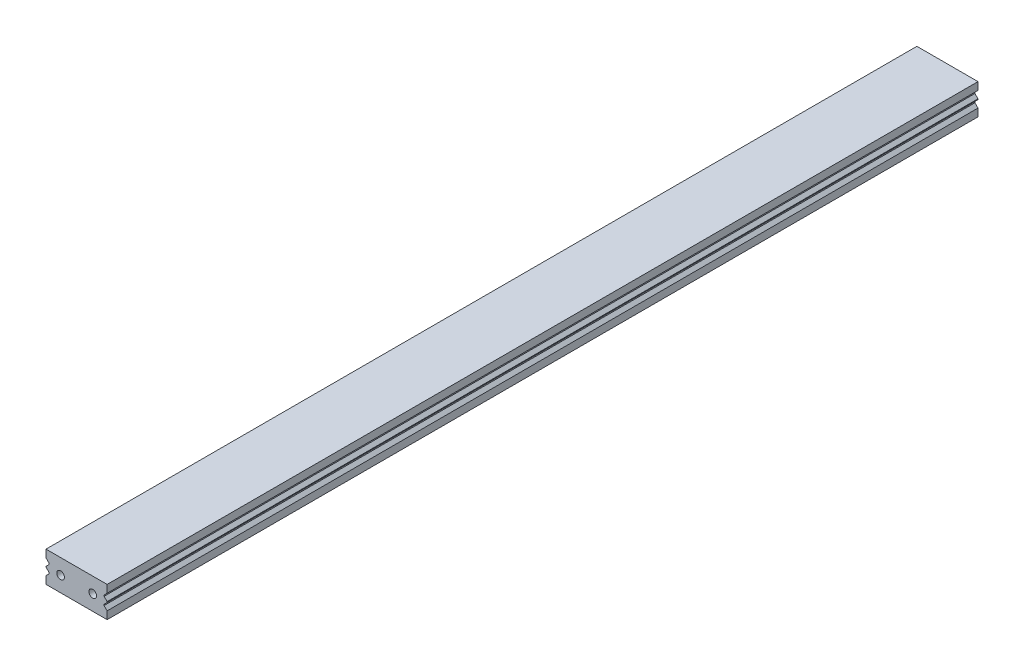
ISO-10303-21;
HEADER;
FILE_DESCRIPTION(('STEP AP214'),'2;1');
FILE_NAME('part.step','',(''),(''),'','','');
FILE_SCHEMA(('AUTOMOTIVE_DESIGN { 1 0 10303 214 1 1 1 1 }'));
ENDSEC;
DATA;
#1=APPLICATION_CONTEXT('core data for automotive mechanical design processes');
#2=APPLICATION_PROTOCOL_DEFINITION('international standard','automotive_design',2000,#1);
#3=PRODUCT_CONTEXT('',#1,'mechanical');
#4=PRODUCT('Part','Part','',(#3));
#5=PRODUCT_RELATED_PRODUCT_CATEGORY('part','',(#4));
#6=PRODUCT_DEFINITION_FORMATION('','',#4);
#7=PRODUCT_DEFINITION_CONTEXT('part definition',#1,'design');
#8=PRODUCT_DEFINITION('design','',#6,#7);
#9=PRODUCT_DEFINITION_SHAPE('','',#8);
#10=(LENGTH_UNIT() NAMED_UNIT(*) SI_UNIT(.MILLI.,.METRE.));
#11=(NAMED_UNIT(*) PLANE_ANGLE_UNIT() SI_UNIT($,.RADIAN.));
#12=(NAMED_UNIT(*) SI_UNIT($,.STERADIAN.) SOLID_ANGLE_UNIT());
#13=UNCERTAINTY_MEASURE_WITH_UNIT(LENGTH_MEASURE(1.E-05),#10,'distance_accuracy_value','');
#14=(GEOMETRIC_REPRESENTATION_CONTEXT(3) GLOBAL_UNCERTAINTY_ASSIGNED_CONTEXT((#13)) GLOBAL_UNIT_ASSIGNED_CONTEXT((#10,
#11,#12)) REPRESENTATION_CONTEXT('',''));
#15=CARTESIAN_POINT('',(0.,0.,0.));
#16=DIRECTION('',(0.,0.,1.));
#17=DIRECTION('',(1.,0.,0.));
#18=AXIS2_PLACEMENT_3D('',#15,#16,#17);
#19=CARTESIAN_POINT('',(10.,10.,-570.));
#20=DIRECTION('',(0.,1.,0.));
#21=DIRECTION('',(0.,0.,1.));
#22=AXIS2_PLACEMENT_3D('',#19,#20,#21);
#23=PLANE('',#22);
#24=DIRECTION('',(-1.,0.,0.));
#25=VECTOR('',#24,1.);
#26=CARTESIAN_POINT('',(10.,10.,0.));
#27=LINE('',#26,#25);
#28=CARTESIAN_POINT('',(50.,10.,0.));
#29=VERTEX_POINT('',#28);
#30=CARTESIAN_POINT('',(10.,10.,0.));
#31=VERTEX_POINT('',#30);
#32=EDGE_CURVE('E156',#29,#31,#27,.T.);
#33=ORIENTED_EDGE('',*,*,#32,.F.);
#34=DIRECTION('',(0.,0.,1.));
#35=VECTOR('',#34,1.);
#36=CARTESIAN_POINT('',(50.,10.,-570.));
#37=LINE('',#36,#35);
#38=CARTESIAN_POINT('',(50.,10.,-570.));
#39=VERTEX_POINT('',#38);
#40=EDGE_CURVE('E160',#39,#29,#37,.T.);
#41=ORIENTED_EDGE('',*,*,#40,.F.);
#42=DIRECTION('',(-1.,0.,0.));
#43=VECTOR('',#42,1.);
#44=CARTESIAN_POINT('',(10.,10.,-570.));
#45=LINE('',#44,#43);
#46=CARTESIAN_POINT('',(10.,10.,-570.));
#47=VERTEX_POINT('',#46);
#48=EDGE_CURVE('E186',#39,#47,#45,.T.);
#49=ORIENTED_EDGE('',*,*,#48,.T.);
#50=DIRECTION('',(0.,0.,1.));
#51=VECTOR('',#50,1.);
#52=CARTESIAN_POINT('',(10.,10.,-570.));
#53=LINE('',#52,#51);
#54=EDGE_CURVE('E43',#47,#31,#53,.T.);
#55=ORIENTED_EDGE('',*,*,#54,.T.);
#56=EDGE_LOOP('',(#33,#41,#49,#55));
#57=FACE_BOUND('',#56,.T.);
#58=ADVANCED_FACE('F40',(#57),#23,.T.);
#59=CARTESIAN_POINT('',(30.,-10.,-570.));
#60=DIRECTION('',(0.,-1.,0.));
#61=DIRECTION('',(0.,0.,-1.));
#62=AXIS2_PLACEMENT_3D('',#59,#60,#61);
#63=PLANE('',#62);
#64=DIRECTION('',(1.,0.,0.));
#65=VECTOR('',#64,1.);
#66=CARTESIAN_POINT('',(30.,-10.,0.));
#67=LINE('',#66,#65);
#68=CARTESIAN_POINT('',(10.,-10.,0.));
#69=VERTEX_POINT('',#68);
#70=CARTESIAN_POINT('',(50.,-10.,0.));
#71=VERTEX_POINT('',#70);
#72=EDGE_CURVE('E184',#69,#71,#67,.T.);
#73=ORIENTED_EDGE('',*,*,#72,.F.);
#74=DIRECTION('',(0.,0.,1.));
#75=VECTOR('',#74,1.);
#76=CARTESIAN_POINT('',(10.,-10.,-570.));
#77=LINE('',#76,#75);
#78=CARTESIAN_POINT('',(10.,-10.,-570.));
#79=VERTEX_POINT('',#78);
#80=EDGE_CURVE('E11',#79,#69,#77,.T.);
#81=ORIENTED_EDGE('',*,*,#80,.F.);
#82=DIRECTION('',(1.,0.,0.));
#83=VECTOR('',#82,1.);
#84=CARTESIAN_POINT('',(30.,-10.,-570.));
#85=LINE('',#84,#83);
#86=CARTESIAN_POINT('',(50.,-10.,-570.));
#87=VERTEX_POINT('',#86);
#88=EDGE_CURVE('E154',#79,#87,#85,.T.);
#89=ORIENTED_EDGE('',*,*,#88,.T.);
#90=DIRECTION('',(0.,0.,1.));
#91=VECTOR('',#90,1.);
#92=CARTESIAN_POINT('',(50.,-10.,-570.));
#93=LINE('',#92,#91);
#94=EDGE_CURVE('E251',#87,#71,#93,.T.);
#95=ORIENTED_EDGE('',*,*,#94,.T.);
#96=EDGE_LOOP('',(#73,#81,#89,#95));
#97=FACE_BOUND('',#96,.T.);
#98=ADVANCED_FACE('F293',(#97),#63,.T.);
#99=CARTESIAN_POINT('',(10.,-10.,-570.));
#100=DIRECTION('',(-1.,0.,0.));
#101=DIRECTION('',(0.,0.,1.));
#102=AXIS2_PLACEMENT_3D('',#99,#100,#101);
#103=PLANE('',#102);
#104=DIRECTION('',(0.,-1.,0.));
#105=VECTOR('',#104,1.);
#106=CARTESIAN_POINT('',(10.,-10.,0.));
#107=LINE('',#106,#105);
#108=CARTESIAN_POINT('',(10.,-5.,0.));
#109=VERTEX_POINT('',#108);
#110=EDGE_CURVE('E181',#109,#69,#107,.T.);
#111=ORIENTED_EDGE('',*,*,#110,.F.);
#112=DIRECTION('',(0.,0.,1.));
#113=VECTOR('',#112,1.);
#114=CARTESIAN_POINT('',(10.,-5.,-570.));
#115=LINE('',#114,#113);
#116=CARTESIAN_POINT('',(10.,-5.,-570.));
#117=VERTEX_POINT('',#116);
#118=EDGE_CURVE('E49',#117,#109,#115,.T.);
#119=ORIENTED_EDGE('',*,*,#118,.F.);
#120=DIRECTION('',(0.,-1.,0.));
#121=VECTOR('',#120,1.);
#122=CARTESIAN_POINT('',(10.,-10.,-570.));
#123=LINE('',#122,#121);
#124=EDGE_CURVE('E144',#117,#79,#123,.T.);
#125=ORIENTED_EDGE('',*,*,#124,.T.);
#126=ORIENTED_EDGE('',*,*,#80,.T.);
#127=EDGE_LOOP('',(#111,#119,#125,#126));
#128=FACE_BOUND('',#127,.T.);
#129=ADVANCED_FACE('F297',(#128),#103,.T.);
#130=CARTESIAN_POINT('',(12.,-3.,-570.));
#131=DIRECTION('',(-0.707106781186548,0.707106781186547,0.));
#132=DIRECTION('',(-0.707106781186547,-0.707106781186548,0.));
#133=AXIS2_PLACEMENT_3D('',#130,#131,#132);
#134=PLANE('',#133);
#135=DIRECTION('',(-0.707106781186547,-0.707106781186548,0.));
#136=VECTOR('',#135,1.);
#137=CARTESIAN_POINT('',(12.,-3.,0.));
#138=LINE('',#137,#136);
#139=CARTESIAN_POINT('',(12.,-3.,0.));
#140=VERTEX_POINT('',#139);
#141=EDGE_CURVE('E129',#140,#109,#138,.T.);
#142=ORIENTED_EDGE('',*,*,#141,.F.);
#143=DIRECTION('',(0.,0.,1.));
#144=VECTOR('',#143,1.);
#145=CARTESIAN_POINT('',(12.,-3.,-570.));
#146=LINE('',#145,#144);
#147=CARTESIAN_POINT('',(12.,-3.,-570.));
#148=VERTEX_POINT('',#147);
#149=EDGE_CURVE('E124',#148,#140,#146,.T.);
#150=ORIENTED_EDGE('',*,*,#149,.F.);
#151=DIRECTION('',(-0.707106781186547,-0.707106781186548,0.));
#152=VECTOR('',#151,1.);
#153=CARTESIAN_POINT('',(12.,-3.,-570.));
#154=LINE('',#153,#152);
#155=EDGE_CURVE('E127',#148,#117,#154,.T.);
#156=ORIENTED_EDGE('',*,*,#155,.T.);
#157=ORIENTED_EDGE('',*,*,#118,.T.);
#158=EDGE_LOOP('',(#142,#150,#156,#157));
#159=FACE_BOUND('',#158,.T.);
#160=ADVANCED_FACE('F126',(#159),#134,.T.);
#161=CARTESIAN_POINT('',(12.,-2.25,-570.));
#162=DIRECTION('',(-1.,0.,0.));
#163=DIRECTION('',(0.,0.,1.));
#164=AXIS2_PLACEMENT_3D('',#161,#162,#163);
#165=PLANE('',#164);
#166=DIRECTION('',(0.,-1.,0.));
#167=VECTOR('',#166,1.);
#168=CARTESIAN_POINT('',(12.,-2.25,0.));
#169=LINE('',#168,#167);
#170=CARTESIAN_POINT('',(12.,-2.25,0.));
#171=VERTEX_POINT('',#170);
#172=EDGE_CURVE('E178',#171,#140,#169,.T.);
#173=ORIENTED_EDGE('',*,*,#172,.F.);
#174=DIRECTION('',(0.,0.,1.));
#175=VECTOR('',#174,1.);
#176=CARTESIAN_POINT('',(12.,-2.25,-570.));
#177=LINE('',#176,#175);
#178=CARTESIAN_POINT('',(12.,-2.25,-570.));
#179=VERTEX_POINT('',#178);
#180=EDGE_CURVE('E134',#179,#171,#177,.T.);
#181=ORIENTED_EDGE('',*,*,#180,.F.);
#182=DIRECTION('',(0.,-1.,0.));
#183=VECTOR('',#182,1.);
#184=CARTESIAN_POINT('',(12.,-2.25,-570.));
#185=LINE('',#184,#183);
#186=EDGE_CURVE('E142',#179,#148,#185,.T.);
#187=ORIENTED_EDGE('',*,*,#186,.T.);
#188=ORIENTED_EDGE('',*,*,#149,.T.);
#189=EDGE_LOOP('',(#173,#181,#187,#188));
#190=FACE_BOUND('',#189,.T.);
#191=ADVANCED_FACE('F146',(#190),#165,.T.);
#192=CARTESIAN_POINT('',(10.,-0.25,-570.));
#193=DIRECTION('',(-0.707106781186547,-0.707106781186547,0.));
#194=DIRECTION('',(0.707106781186548,-0.707106781186548,0.));
#195=AXIS2_PLACEMENT_3D('',#192,#193,#194);
#196=PLANE('',#195);
#197=DIRECTION('',(0.707106781186548,-0.707106781186548,0.));
#198=VECTOR('',#197,1.);
#199=CARTESIAN_POINT('',(10.,-0.25,0.));
#200=LINE('',#199,#198);
#201=CARTESIAN_POINT('',(10.,-0.25,0.));
#202=VERTEX_POINT('',#201);
#203=EDGE_CURVE('E175',#202,#171,#200,.T.);
#204=ORIENTED_EDGE('',*,*,#203,.F.);
#205=DIRECTION('',(0.,0.,1.));
#206=VECTOR('',#205,1.);
#207=CARTESIAN_POINT('',(10.,-0.25,-570.));
#208=LINE('',#207,#206);
#209=CARTESIAN_POINT('',(10.,-0.25,-570.));
#210=VERTEX_POINT('',#209);
#211=EDGE_CURVE('E190',#210,#202,#208,.T.);
#212=ORIENTED_EDGE('',*,*,#211,.F.);
#213=DIRECTION('',(0.707106781186548,-0.707106781186548,0.));
#214=VECTOR('',#213,1.);
#215=CARTESIAN_POINT('',(10.,-0.25,-570.));
#216=LINE('',#215,#214);
#217=EDGE_CURVE('E147',#210,#179,#216,.T.);
#218=ORIENTED_EDGE('',*,*,#217,.T.);
#219=ORIENTED_EDGE('',*,*,#180,.T.);
#220=EDGE_LOOP('',(#204,#212,#218,#219));
#221=FACE_BOUND('',#220,.T.);
#222=ADVANCED_FACE('F283',(#221),#196,.T.);
#223=CARTESIAN_POINT('',(10.,0.25,-570.));
#224=DIRECTION('',(-1.,0.,0.));
#225=DIRECTION('',(0.,-1.,0.));
#226=AXIS2_PLACEMENT_3D('',#223,#224,#225);
#227=PLANE('',#226);
#228=DIRECTION('',(0.,-1.,0.));
#229=VECTOR('',#228,1.);
#230=CARTESIAN_POINT('',(10.,0.25,0.));
#231=LINE('',#230,#229);
#232=CARTESIAN_POINT('',(10.,0.25,0.));
#233=VERTEX_POINT('',#232);
#234=EDGE_CURVE('E172',#233,#202,#231,.T.);
#235=ORIENTED_EDGE('',*,*,#234,.F.);
#236=DIRECTION('',(0.,0.,1.));
#237=VECTOR('',#236,1.);
#238=CARTESIAN_POINT('',(10.,0.25,-570.));
#239=LINE('',#238,#237);
#240=CARTESIAN_POINT('',(10.,0.25,-570.));
#241=VERTEX_POINT('',#240);
#242=EDGE_CURVE('E192',#241,#233,#239,.T.);
#243=ORIENTED_EDGE('',*,*,#242,.F.);
#244=DIRECTION('',(0.,-1.,0.));
#245=VECTOR('',#244,1.);
#246=CARTESIAN_POINT('',(10.,0.25,-570.));
#247=LINE('',#246,#245);
#248=EDGE_CURVE('E149',#241,#210,#247,.T.);
#249=ORIENTED_EDGE('',*,*,#248,.T.);
#250=ORIENTED_EDGE('',*,*,#211,.T.);
#251=EDGE_LOOP('',(#235,#243,#249,#250));
#252=FACE_BOUND('',#251,.T.);
#253=ADVANCED_FACE('F269',(#252),#227,.T.);
#254=CARTESIAN_POINT('',(12.,2.25,-570.));
#255=DIRECTION('',(-0.707106781186548,0.707106781186547,0.));
#256=DIRECTION('',(-0.707106781186547,-0.707106781186548,0.));
#257=AXIS2_PLACEMENT_3D('',#254,#255,#256);
#258=PLANE('',#257);
#259=DIRECTION('',(-0.707106781186547,-0.707106781186548,0.));
#260=VECTOR('',#259,1.);
#261=CARTESIAN_POINT('',(12.,2.25,0.));
#262=LINE('',#261,#260);
#263=CARTESIAN_POINT('',(12.,2.25,0.));
#264=VERTEX_POINT('',#263);
#265=EDGE_CURVE('E169',#264,#233,#262,.T.);
#266=ORIENTED_EDGE('',*,*,#265,.F.);
#267=DIRECTION('',(0.,0.,1.));
#268=VECTOR('',#267,1.);
#269=CARTESIAN_POINT('',(12.,2.25,-570.));
#270=LINE('',#269,#268);
#271=CARTESIAN_POINT('',(12.,2.25,-570.));
#272=VERTEX_POINT('',#271);
#273=EDGE_CURVE('E194',#272,#264,#270,.T.);
#274=ORIENTED_EDGE('',*,*,#273,.F.);
#275=DIRECTION('',(-0.707106781186547,-0.707106781186548,0.));
#276=VECTOR('',#275,1.);
#277=CARTESIAN_POINT('',(12.,2.25,-570.));
#278=LINE('',#277,#276);
#279=EDGE_CURVE('E263',#272,#241,#278,.T.);
#280=ORIENTED_EDGE('',*,*,#279,.T.);
#281=ORIENTED_EDGE('',*,*,#242,.T.);
#282=EDGE_LOOP('',(#266,#274,#280,#281));
#283=FACE_BOUND('',#282,.T.);
#284=ADVANCED_FACE('F275',(#283),#258,.T.);
#285=CARTESIAN_POINT('',(12.,3.,-570.));
#286=DIRECTION('',(-1.,0.,0.));
#287=DIRECTION('',(0.,0.,1.));
#288=AXIS2_PLACEMENT_3D('',#285,#286,#287);
#289=PLANE('',#288);
#290=DIRECTION('',(0.,-1.,0.));
#291=VECTOR('',#290,1.);
#292=CARTESIAN_POINT('',(12.,3.,0.));
#293=LINE('',#292,#291);
#294=CARTESIAN_POINT('',(12.,3.,0.));
#295=VERTEX_POINT('',#294);
#296=EDGE_CURVE('E166',#295,#264,#293,.T.);
#297=ORIENTED_EDGE('',*,*,#296,.F.);
#298=DIRECTION('',(0.,0.,1.));
#299=VECTOR('',#298,1.);
#300=CARTESIAN_POINT('',(12.,3.,-570.));
#301=LINE('',#300,#299);
#302=CARTESIAN_POINT('',(12.,3.,-570.));
#303=VERTEX_POINT('',#302);
#304=EDGE_CURVE('E196',#303,#295,#301,.T.);
#305=ORIENTED_EDGE('',*,*,#304,.F.);
#306=DIRECTION('',(0.,-1.,0.));
#307=VECTOR('',#306,1.);
#308=CARTESIAN_POINT('',(12.,3.,-570.));
#309=LINE('',#308,#307);
#310=EDGE_CURVE('E260',#303,#272,#309,.T.);
#311=ORIENTED_EDGE('',*,*,#310,.T.);
#312=ORIENTED_EDGE('',*,*,#273,.T.);
#313=EDGE_LOOP('',(#297,#305,#311,#312));
#314=FACE_BOUND('',#313,.T.);
#315=ADVANCED_FACE('F278',(#314),#289,.T.);
#316=CARTESIAN_POINT('',(10.,5.,-570.));
#317=DIRECTION('',(-0.707106781186547,-0.707106781186547,0.));
#318=DIRECTION('',(0.707106781186548,-0.707106781186548,0.));
#319=AXIS2_PLACEMENT_3D('',#316,#317,#318);
#320=PLANE('',#319);
#321=DIRECTION('',(0.707106781186548,-0.707106781186548,0.));
#322=VECTOR('',#321,1.);
#323=CARTESIAN_POINT('',(10.,5.,0.));
#324=LINE('',#323,#322);
#325=CARTESIAN_POINT('',(10.,5.,0.));
#326=VERTEX_POINT('',#325);
#327=EDGE_CURVE('E163',#326,#295,#324,.T.);
#328=ORIENTED_EDGE('',*,*,#327,.F.);
#329=DIRECTION('',(0.,0.,1.));
#330=VECTOR('',#329,1.);
#331=CARTESIAN_POINT('',(10.,5.,-570.));
#332=LINE('',#331,#330);
#333=CARTESIAN_POINT('',(10.,5.,-570.));
#334=VERTEX_POINT('',#333);
#335=EDGE_CURVE('E197',#334,#326,#332,.T.);
#336=ORIENTED_EDGE('',*,*,#335,.F.);
#337=DIRECTION('',(0.707106781186548,-0.707106781186548,0.));
#338=VECTOR('',#337,1.);
#339=CARTESIAN_POINT('',(10.,5.,-570.));
#340=LINE('',#339,#338);
#341=EDGE_CURVE('E257',#334,#303,#340,.T.);
#342=ORIENTED_EDGE('',*,*,#341,.T.);
#343=ORIENTED_EDGE('',*,*,#304,.T.);
#344=EDGE_LOOP('',(#328,#336,#342,#343));
#345=FACE_BOUND('',#344,.T.);
#346=ADVANCED_FACE('F281',(#345),#320,.T.);
#347=CARTESIAN_POINT('',(10.,5.,-570.));
#348=DIRECTION('',(-1.,0.,0.));
#349=DIRECTION('',(0.,0.,1.));
#350=AXIS2_PLACEMENT_3D('',#347,#348,#349);
#351=PLANE('',#350);
#352=DIRECTION('',(0.,-1.,0.));
#353=VECTOR('',#352,1.);
#354=CARTESIAN_POINT('',(10.,5.,0.));
#355=LINE('',#354,#353);
#356=EDGE_CURVE('E159',#31,#326,#355,.T.);
#357=ORIENTED_EDGE('',*,*,#356,.F.);
#358=ORIENTED_EDGE('',*,*,#54,.F.);
#359=DIRECTION('',(0.,-1.,0.));
#360=VECTOR('',#359,1.);
#361=CARTESIAN_POINT('',(10.,5.,-570.));
#362=LINE('',#361,#360);
#363=EDGE_CURVE('E255',#47,#334,#362,.T.);
#364=ORIENTED_EDGE('',*,*,#363,.T.);
#365=ORIENTED_EDGE('',*,*,#335,.T.);
#366=EDGE_LOOP('',(#357,#358,#364,#365));
#367=FACE_BOUND('',#366,.T.);
#368=ADVANCED_FACE('F204',(#367),#351,.T.);
#369=CARTESIAN_POINT('',(0.,0.,-570.));
#370=DIRECTION('',(0.,0.,-1.));
#371=DIRECTION('',(-1.,0.,0.));
#372=AXIS2_PLACEMENT_3D('',#369,#370,#371);
#373=PLANE('',#372);
#374=CARTESIAN_POINT('',(40.,0.,-570.));
#375=DIRECTION('',(0.,0.,-1.));
#376=DIRECTION('',(-1.,0.,0.));
#377=AXIS2_PLACEMENT_3D('',#374,#375,#376);
#378=CIRCLE('',#377,2.49999999999999);
#379=CARTESIAN_POINT('',(37.5,0.,-570.));
#380=VERTEX_POINT('',#379);
#381=EDGE_CURVE('E620',#380,#380,#378,.T.);
#382=ORIENTED_EDGE('',*,*,#381,.F.);
#383=EDGE_LOOP('',(#382));
#384=FACE_BOUND('',#383,.T.);
#385=CARTESIAN_POINT('',(20.,0.,-570.));
#386=DIRECTION('',(0.,0.,-1.));
#387=DIRECTION('',(-1.,0.,0.));
#388=AXIS2_PLACEMENT_3D('',#385,#386,#387);
#389=CIRCLE('',#388,2.49999999999999);
#390=CARTESIAN_POINT('',(17.5,0.,-570.));
#391=VERTEX_POINT('',#390);
#392=EDGE_CURVE('E626',#391,#391,#389,.T.);
#393=ORIENTED_EDGE('',*,*,#392,.F.);
#394=EDGE_LOOP('',(#393));
#395=FACE_BOUND('',#394,.T.);
#396=ORIENTED_EDGE('',*,*,#48,.F.);
#397=DIRECTION('',(0.,-1.,0.));
#398=VECTOR('',#397,1.);
#399=CARTESIAN_POINT('',(50.,5.,-570.));
#400=LINE('',#399,#398);
#401=CARTESIAN_POINT('',(50.,5.,-570.));
#402=VERTEX_POINT('',#401);
#403=EDGE_CURVE('E224',#39,#402,#400,.T.);
#404=ORIENTED_EDGE('',*,*,#403,.T.);
#405=DIRECTION('',(-0.707106781186548,-0.707106781186548,0.));
#406=VECTOR('',#405,1.);
#407=CARTESIAN_POINT('',(50.,5.,-570.));
#408=LINE('',#407,#406);
#409=CARTESIAN_POINT('',(48.,3.,-570.));
#410=VERTEX_POINT('',#409);
#411=EDGE_CURVE('E653',#402,#410,#408,.T.);
#412=ORIENTED_EDGE('',*,*,#411,.T.);
#413=DIRECTION('',(0.,-1.,0.));
#414=VECTOR('',#413,1.);
#415=CARTESIAN_POINT('',(48.,3.,-570.));
#416=LINE('',#415,#414);
#417=CARTESIAN_POINT('',(48.,2.25,-570.));
#418=VERTEX_POINT('',#417);
#419=EDGE_CURVE('E650',#410,#418,#416,.T.);
#420=ORIENTED_EDGE('',*,*,#419,.T.);
#421=DIRECTION('',(0.707106781186547,-0.707106781186548,0.));
#422=VECTOR('',#421,1.);
#423=CARTESIAN_POINT('',(48.,2.25,-570.));
#424=LINE('',#423,#422);
#425=CARTESIAN_POINT('',(50.,0.25,-570.));
#426=VERTEX_POINT('',#425);
#427=EDGE_CURVE('E647',#418,#426,#424,.T.);
#428=ORIENTED_EDGE('',*,*,#427,.T.);
#429=DIRECTION('',(0.,-1.,0.));
#430=VECTOR('',#429,1.);
#431=CARTESIAN_POINT('',(50.,0.25,-570.));
#432=LINE('',#431,#430);
#433=CARTESIAN_POINT('',(50.,-0.25,-570.));
#434=VERTEX_POINT('',#433);
#435=EDGE_CURVE('E644',#426,#434,#432,.T.);
#436=ORIENTED_EDGE('',*,*,#435,.T.);
#437=DIRECTION('',(-0.707106781186548,-0.707106781186548,0.));
#438=VECTOR('',#437,1.);
#439=CARTESIAN_POINT('',(50.,-0.25,-570.));
#440=LINE('',#439,#438);
#441=CARTESIAN_POINT('',(48.,-2.25,-570.));
#442=VERTEX_POINT('',#441);
#443=EDGE_CURVE('E641',#434,#442,#440,.T.);
#444=ORIENTED_EDGE('',*,*,#443,.T.);
#445=DIRECTION('',(0.,-1.,0.));
#446=VECTOR('',#445,1.);
#447=CARTESIAN_POINT('',(48.,-2.25,-570.));
#448=LINE('',#447,#446);
#449=CARTESIAN_POINT('',(48.,-3.,-570.));
#450=VERTEX_POINT('',#449);
#451=EDGE_CURVE('E638',#442,#450,#448,.T.);
#452=ORIENTED_EDGE('',*,*,#451,.T.);
#453=DIRECTION('',(0.707106781186547,-0.707106781186548,0.));
#454=VECTOR('',#453,1.);
#455=CARTESIAN_POINT('',(48.,-3.,-570.));
#456=LINE('',#455,#454);
#457=CARTESIAN_POINT('',(50.,-5.,-570.));
#458=VERTEX_POINT('',#457);
#459=EDGE_CURVE('E635',#450,#458,#456,.T.);
#460=ORIENTED_EDGE('',*,*,#459,.T.);
#461=DIRECTION('',(0.,-1.,0.));
#462=VECTOR('',#461,1.);
#463=CARTESIAN_POINT('',(50.,-10.,-570.));
#464=LINE('',#463,#462);
#465=EDGE_CURVE('E219',#458,#87,#464,.T.);
#466=ORIENTED_EDGE('',*,*,#465,.T.);
#467=ORIENTED_EDGE('',*,*,#88,.F.);
#468=ORIENTED_EDGE('',*,*,#124,.F.);
#469=ORIENTED_EDGE('',*,*,#155,.F.);
#470=ORIENTED_EDGE('',*,*,#186,.F.);
#471=ORIENTED_EDGE('',*,*,#217,.F.);
#472=ORIENTED_EDGE('',*,*,#248,.F.);
#473=ORIENTED_EDGE('',*,*,#279,.F.);
#474=ORIENTED_EDGE('',*,*,#310,.F.);
#475=ORIENTED_EDGE('',*,*,#341,.F.);
#476=ORIENTED_EDGE('',*,*,#363,.F.);
#477=EDGE_LOOP('',(#396,#404,#412,#420,#428,#436,#444,#452,#460,#466,#467,#468,#469,#470,#471,
#472,#473,#474,#475,#476));
#478=FACE_BOUND('',#477,.T.);
#479=ADVANCED_FACE('F140',(#384,#395,#478),#373,.T.);
#480=CARTESIAN_POINT('',(0.,0.,0.));
#481=DIRECTION('',(0.,0.,-1.));
#482=DIRECTION('',(-1.,0.,0.));
#483=AXIS2_PLACEMENT_3D('',#480,#481,#482);
#484=PLANE('',#483);
#485=CARTESIAN_POINT('',(19.5727462659231,0.,0.));
#486=DIRECTION('',(0.,0.,1.));
#487=DIRECTION('',(1.,0.,0.));
#488=AXIS2_PLACEMENT_3D('',#485,#486,#487);
#489=CIRCLE('',#488,2.5);
#490=CARTESIAN_POINT('',(22.0727462659231,0.,0.));
#491=VERTEX_POINT('',#490);
#492=EDGE_CURVE('E610',#491,#491,#489,.T.);
#493=ORIENTED_EDGE('',*,*,#492,.F.);
#494=EDGE_LOOP('',(#493));
#495=FACE_BOUND('',#494,.T.);
#496=CARTESIAN_POINT('',(40.5727462659231,0.,0.));
#497=DIRECTION('',(0.,0.,1.));
#498=DIRECTION('',(1.,0.,0.));
#499=AXIS2_PLACEMENT_3D('',#496,#497,#498);
#500=CIRCLE('',#499,2.5);
#501=CARTESIAN_POINT('',(43.0727462659231,0.,0.));
#502=VERTEX_POINT('',#501);
#503=EDGE_CURVE('E612',#502,#502,#500,.T.);
#504=ORIENTED_EDGE('',*,*,#503,.F.);
#505=EDGE_LOOP('',(#504));
#506=FACE_BOUND('',#505,.T.);
#507=ORIENTED_EDGE('',*,*,#32,.T.);
#508=ORIENTED_EDGE('',*,*,#356,.T.);
#509=ORIENTED_EDGE('',*,*,#327,.T.);
#510=ORIENTED_EDGE('',*,*,#296,.T.);
#511=ORIENTED_EDGE('',*,*,#265,.T.);
#512=ORIENTED_EDGE('',*,*,#234,.T.);
#513=ORIENTED_EDGE('',*,*,#203,.T.);
#514=ORIENTED_EDGE('',*,*,#172,.T.);
#515=ORIENTED_EDGE('',*,*,#141,.T.);
#516=ORIENTED_EDGE('',*,*,#110,.T.);
#517=ORIENTED_EDGE('',*,*,#72,.T.);
#518=DIRECTION('',(0.,-1.,0.));
#519=VECTOR('',#518,1.);
#520=CARTESIAN_POINT('',(50.,-10.,0.));
#521=LINE('',#520,#519);
#522=CARTESIAN_POINT('',(50.,-5.,0.));
#523=VERTEX_POINT('',#522);
#524=EDGE_CURVE('E632',#523,#71,#521,.T.);
#525=ORIENTED_EDGE('',*,*,#524,.F.);
#526=DIRECTION('',(0.707106781186547,-0.707106781186548,0.));
#527=VECTOR('',#526,1.);
#528=CARTESIAN_POINT('',(48.,-3.,0.));
#529=LINE('',#528,#527);
#530=CARTESIAN_POINT('',(48.,-3.,0.));
#531=VERTEX_POINT('',#530);
#532=EDGE_CURVE('E659',#531,#523,#529,.T.);
#533=ORIENTED_EDGE('',*,*,#532,.F.);
#534=DIRECTION('',(0.,-1.,0.));
#535=VECTOR('',#534,1.);
#536=CARTESIAN_POINT('',(48.,-2.25,0.));
#537=LINE('',#536,#535);
#538=CARTESIAN_POINT('',(48.,-2.25,0.));
#539=VERTEX_POINT('',#538);
#540=EDGE_CURVE('E662',#539,#531,#537,.T.);
#541=ORIENTED_EDGE('',*,*,#540,.F.);
#542=DIRECTION('',(-0.707106781186548,-0.707106781186548,0.));
#543=VECTOR('',#542,1.);
#544=CARTESIAN_POINT('',(50.,-0.25,0.));
#545=LINE('',#544,#543);
#546=CARTESIAN_POINT('',(50.,-0.25,0.));
#547=VERTEX_POINT('',#546);
#548=EDGE_CURVE('E665',#547,#539,#545,.T.);
#549=ORIENTED_EDGE('',*,*,#548,.F.);
#550=DIRECTION('',(0.,-1.,0.));
#551=VECTOR('',#550,1.);
#552=CARTESIAN_POINT('',(50.,0.25,0.));
#553=LINE('',#552,#551);
#554=CARTESIAN_POINT('',(50.,0.25,0.));
#555=VERTEX_POINT('',#554);
#556=EDGE_CURVE('E668',#555,#547,#553,.T.);
#557=ORIENTED_EDGE('',*,*,#556,.F.);
#558=DIRECTION('',(0.707106781186547,-0.707106781186548,0.));
#559=VECTOR('',#558,1.);
#560=CARTESIAN_POINT('',(48.,2.25,0.));
#561=LINE('',#560,#559);
#562=CARTESIAN_POINT('',(48.,2.25,0.));
#563=VERTEX_POINT('',#562);
#564=EDGE_CURVE('E671',#563,#555,#561,.T.);
#565=ORIENTED_EDGE('',*,*,#564,.F.);
#566=DIRECTION('',(0.,-1.,0.));
#567=VECTOR('',#566,1.);
#568=CARTESIAN_POINT('',(48.,3.,0.));
#569=LINE('',#568,#567);
#570=CARTESIAN_POINT('',(48.,3.,0.));
#571=VERTEX_POINT('',#570);
#572=EDGE_CURVE('E674',#571,#563,#569,.T.);
#573=ORIENTED_EDGE('',*,*,#572,.F.);
#574=DIRECTION('',(-0.707106781186548,-0.707106781186548,0.));
#575=VECTOR('',#574,1.);
#576=CARTESIAN_POINT('',(50.,5.,0.));
#577=LINE('',#576,#575);
#578=CARTESIAN_POINT('',(50.,5.,0.));
#579=VERTEX_POINT('',#578);
#580=EDGE_CURVE('E214',#579,#571,#577,.T.);
#581=ORIENTED_EDGE('',*,*,#580,.F.);
#582=DIRECTION('',(0.,-1.,0.));
#583=VECTOR('',#582,1.);
#584=CARTESIAN_POINT('',(50.,5.,0.));
#585=LINE('',#584,#583);
#586=EDGE_CURVE('E209',#29,#579,#585,.T.);
#587=ORIENTED_EDGE('',*,*,#586,.F.);
#588=EDGE_LOOP('',(#507,#508,#509,#510,#511,#512,#513,#514,#515,#516,#517,#525,#533,#541,#549,
#557,#565,#573,#581,#587));
#589=FACE_BOUND('',#588,.T.);
#590=ADVANCED_FACE('F206',(#495,#506,#589),#484,.F.);
#591=CARTESIAN_POINT('',(50.,5.,-570.));
#592=DIRECTION('',(-1.,0.,0.));
#593=DIRECTION('',(0.,0.,1.));
#594=AXIS2_PLACEMENT_3D('',#591,#592,#593);
#595=PLANE('',#594);
#596=ORIENTED_EDGE('',*,*,#586,.T.);
#597=DIRECTION('',(0.,0.,1.));
#598=VECTOR('',#597,1.);
#599=CARTESIAN_POINT('',(50.,5.,-570.));
#600=LINE('',#599,#598);
#601=EDGE_CURVE('E225',#402,#579,#600,.T.);
#602=ORIENTED_EDGE('',*,*,#601,.F.);
#603=ORIENTED_EDGE('',*,*,#403,.F.);
#604=ORIENTED_EDGE('',*,*,#40,.T.);
#605=EDGE_LOOP('',(#596,#602,#603,#604));
#606=FACE_BOUND('',#605,.T.);
#607=ADVANCED_FACE('F222',(#606),#595,.F.);
#608=CARTESIAN_POINT('',(50.,5.,-570.));
#609=DIRECTION('',(-0.707106781186547,0.707106781186547,0.));
#610=DIRECTION('',(-0.707106781186548,-0.707106781186548,0.));
#611=AXIS2_PLACEMENT_3D('',#608,#609,#610);
#612=PLANE('',#611);
#613=ORIENTED_EDGE('',*,*,#580,.T.);
#614=DIRECTION('',(0.,0.,1.));
#615=VECTOR('',#614,1.);
#616=CARTESIAN_POINT('',(48.,3.,-570.));
#617=LINE('',#616,#615);
#618=EDGE_CURVE('E227',#410,#571,#617,.T.);
#619=ORIENTED_EDGE('',*,*,#618,.F.);
#620=ORIENTED_EDGE('',*,*,#411,.F.);
#621=ORIENTED_EDGE('',*,*,#601,.T.);
#622=EDGE_LOOP('',(#613,#619,#620,#621));
#623=FACE_BOUND('',#622,.T.);
#624=ADVANCED_FACE('F379',(#623),#612,.F.);
#625=CARTESIAN_POINT('',(48.,3.,-570.));
#626=DIRECTION('',(-1.,0.,0.));
#627=DIRECTION('',(0.,0.,1.));
#628=AXIS2_PLACEMENT_3D('',#625,#626,#627);
#629=PLANE('',#628);
#630=ORIENTED_EDGE('',*,*,#572,.T.);
#631=DIRECTION('',(0.,0.,1.));
#632=VECTOR('',#631,1.);
#633=CARTESIAN_POINT('',(48.,2.25,-570.));
#634=LINE('',#633,#632);
#635=EDGE_CURVE('E233',#418,#563,#634,.T.);
#636=ORIENTED_EDGE('',*,*,#635,.F.);
#637=ORIENTED_EDGE('',*,*,#419,.F.);
#638=ORIENTED_EDGE('',*,*,#618,.T.);
#639=EDGE_LOOP('',(#630,#636,#637,#638));
#640=FACE_BOUND('',#639,.T.);
#641=ADVANCED_FACE('F390',(#640),#629,.F.);
#642=CARTESIAN_POINT('',(48.,2.25,-570.));
#643=DIRECTION('',(-0.707106781186548,-0.707106781186547,0.));
#644=DIRECTION('',(0.707106781186547,-0.707106781186548,0.));
#645=AXIS2_PLACEMENT_3D('',#642,#643,#644);
#646=PLANE('',#645);
#647=ORIENTED_EDGE('',*,*,#564,.T.);
#648=DIRECTION('',(0.,0.,1.));
#649=VECTOR('',#648,1.);
#650=CARTESIAN_POINT('',(50.,0.25,-570.));
#651=LINE('',#650,#649);
#652=EDGE_CURVE('E236',#426,#555,#651,.T.);
#653=ORIENTED_EDGE('',*,*,#652,.F.);
#654=ORIENTED_EDGE('',*,*,#427,.F.);
#655=ORIENTED_EDGE('',*,*,#635,.T.);
#656=EDGE_LOOP('',(#647,#653,#654,#655));
#657=FACE_BOUND('',#656,.T.);
#658=ADVANCED_FACE('F400',(#657),#646,.F.);
#659=CARTESIAN_POINT('',(50.,0.25,-570.));
#660=DIRECTION('',(-1.,0.,0.));
#661=DIRECTION('',(0.,-1.,0.));
#662=AXIS2_PLACEMENT_3D('',#659,#660,#661);
#663=PLANE('',#662);
#664=ORIENTED_EDGE('',*,*,#556,.T.);
#665=DIRECTION('',(0.,0.,1.));
#666=VECTOR('',#665,1.);
#667=CARTESIAN_POINT('',(50.,-0.25,-570.));
#668=LINE('',#667,#666);
#669=EDGE_CURVE('E239',#434,#547,#668,.T.);
#670=ORIENTED_EDGE('',*,*,#669,.F.);
#671=ORIENTED_EDGE('',*,*,#435,.F.);
#672=ORIENTED_EDGE('',*,*,#652,.T.);
#673=EDGE_LOOP('',(#664,#670,#671,#672));
#674=FACE_BOUND('',#673,.T.);
#675=ADVANCED_FACE('F410',(#674),#663,.F.);
#676=CARTESIAN_POINT('',(50.,-0.25,-570.));
#677=DIRECTION('',(-0.707106781186547,0.707106781186547,0.));
#678=DIRECTION('',(-0.707106781186548,-0.707106781186548,0.));
#679=AXIS2_PLACEMENT_3D('',#676,#677,#678);
#680=PLANE('',#679);
#681=ORIENTED_EDGE('',*,*,#548,.T.);
#682=DIRECTION('',(0.,0.,1.));
#683=VECTOR('',#682,1.);
#684=CARTESIAN_POINT('',(48.,-2.25,-570.));
#685=LINE('',#684,#683);
#686=EDGE_CURVE('E242',#442,#539,#685,.T.);
#687=ORIENTED_EDGE('',*,*,#686,.F.);
#688=ORIENTED_EDGE('',*,*,#443,.F.);
#689=ORIENTED_EDGE('',*,*,#669,.T.);
#690=EDGE_LOOP('',(#681,#687,#688,#689));
#691=FACE_BOUND('',#690,.T.);
#692=ADVANCED_FACE('F420',(#691),#680,.F.);
#693=CARTESIAN_POINT('',(48.,-2.25,-570.));
#694=DIRECTION('',(-1.,0.,0.));
#695=DIRECTION('',(0.,0.,1.));
#696=AXIS2_PLACEMENT_3D('',#693,#694,#695);
#697=PLANE('',#696);
#698=ORIENTED_EDGE('',*,*,#540,.T.);
#699=DIRECTION('',(0.,0.,1.));
#700=VECTOR('',#699,1.);
#701=CARTESIAN_POINT('',(48.,-3.,-570.));
#702=LINE('',#701,#700);
#703=EDGE_CURVE('E245',#450,#531,#702,.T.);
#704=ORIENTED_EDGE('',*,*,#703,.F.);
#705=ORIENTED_EDGE('',*,*,#451,.F.);
#706=ORIENTED_EDGE('',*,*,#686,.T.);
#707=EDGE_LOOP('',(#698,#704,#705,#706));
#708=FACE_BOUND('',#707,.T.);
#709=ADVANCED_FACE('F430',(#708),#697,.F.);
#710=CARTESIAN_POINT('',(48.,-3.,-570.));
#711=DIRECTION('',(-0.707106781186548,-0.707106781186547,0.));
#712=DIRECTION('',(0.707106781186547,-0.707106781186548,0.));
#713=AXIS2_PLACEMENT_3D('',#710,#711,#712);
#714=PLANE('',#713);
#715=ORIENTED_EDGE('',*,*,#532,.T.);
#716=DIRECTION('',(0.,0.,1.));
#717=VECTOR('',#716,1.);
#718=CARTESIAN_POINT('',(50.,-5.,-570.));
#719=LINE('',#718,#717);
#720=EDGE_CURVE('E248',#458,#523,#719,.T.);
#721=ORIENTED_EDGE('',*,*,#720,.F.);
#722=ORIENTED_EDGE('',*,*,#459,.F.);
#723=ORIENTED_EDGE('',*,*,#703,.T.);
#724=EDGE_LOOP('',(#715,#721,#722,#723));
#725=FACE_BOUND('',#724,.T.);
#726=ADVANCED_FACE('F440',(#725),#714,.F.);
#727=CARTESIAN_POINT('',(50.,-10.,-570.));
#728=DIRECTION('',(-1.,0.,0.));
#729=DIRECTION('',(0.,0.,1.));
#730=AXIS2_PLACEMENT_3D('',#727,#728,#729);
#731=PLANE('',#730);
#732=ORIENTED_EDGE('',*,*,#524,.T.);
#733=ORIENTED_EDGE('',*,*,#94,.F.);
#734=ORIENTED_EDGE('',*,*,#465,.F.);
#735=ORIENTED_EDGE('',*,*,#720,.T.);
#736=EDGE_LOOP('',(#732,#733,#734,#735));
#737=FACE_BOUND('',#736,.T.);
#738=ADVANCED_FACE('F450',(#737),#731,.F.);
#739=CARTESIAN_POINT('',(20.,0.,-553.));
#740=DIRECTION('',(0.,0.,-1.));
#741=DIRECTION('',(-1.,0.,0.));
#742=AXIS2_PLACEMENT_3D('',#739,#740,#741);
#743=CONICAL_SURFACE('',#742,2.5,1.02974425867664);
#744=CARTESIAN_POINT('',(20.,0.,-551.497848452431));
#745=VERTEX_POINT('',#744);
#746=VERTEX_LOOP('',#745);
#747=FACE_BOUND('',#746,.T.);
#748=CARTESIAN_POINT('',(20.,0.,-553.));
#749=DIRECTION('',(0.,0.,-1.));
#750=DIRECTION('',(-1.,0.,0.));
#751=AXIS2_PLACEMENT_3D('',#748,#749,#750);
#752=CIRCLE('',#751,2.5);
#753=CARTESIAN_POINT('',(17.5,0.,-553.));
#754=VERTEX_POINT('',#753);
#755=EDGE_CURVE('E629',#754,#754,#752,.T.);
#756=ORIENTED_EDGE('',*,*,#755,.T.);
#757=EDGE_LOOP('',(#756));
#758=FACE_BOUND('',#757,.T.);
#759=ADVANCED_FACE('F460',(#747,#758),#743,.F.);
#760=CARTESIAN_POINT('',(20.,0.,-570.));
#761=DIRECTION('',(0.,0.,-1.));
#762=DIRECTION('',(-1.,0.,0.));
#763=AXIS2_PLACEMENT_3D('',#760,#761,#762);
#764=CYLINDRICAL_SURFACE('',#763,2.5);
#765=ORIENTED_EDGE('',*,*,#755,.F.);
#766=EDGE_LOOP('',(#765));
#767=FACE_BOUND('',#766,.T.);
#768=ORIENTED_EDGE('',*,*,#392,.T.);
#769=EDGE_LOOP('',(#768));
#770=FACE_BOUND('',#769,.T.);
#771=ADVANCED_FACE('F479',(#767,#770),#764,.F.);
#772=CARTESIAN_POINT('',(40.,0.,-553.));
#773=DIRECTION('',(0.,0.,-1.));
#774=DIRECTION('',(-1.,0.,0.));
#775=AXIS2_PLACEMENT_3D('',#772,#773,#774);
#776=CONICAL_SURFACE('',#775,2.5,1.02974425867664);
#777=CARTESIAN_POINT('',(40.,0.,-551.497848452431));
#778=VERTEX_POINT('',#777);
#779=VERTEX_LOOP('',#778);
#780=FACE_BOUND('',#779,.T.);
#781=CARTESIAN_POINT('',(40.,0.,-553.));
#782=DIRECTION('',(0.,0.,-1.));
#783=DIRECTION('',(-1.,0.,0.));
#784=AXIS2_PLACEMENT_3D('',#781,#782,#783);
#785=CIRCLE('',#784,2.5);
#786=CARTESIAN_POINT('',(37.5,0.,-553.));
#787=VERTEX_POINT('',#786);
#788=EDGE_CURVE('E623',#787,#787,#785,.T.);
#789=ORIENTED_EDGE('',*,*,#788,.T.);
#790=EDGE_LOOP('',(#789));
#791=FACE_BOUND('',#790,.T.);
#792=ADVANCED_FACE('F490',(#780,#791),#776,.F.);
#793=CARTESIAN_POINT('',(40.,0.,-570.));
#794=DIRECTION('',(0.,0.,-1.));
#795=DIRECTION('',(-1.,0.,0.));
#796=AXIS2_PLACEMENT_3D('',#793,#794,#795);
#797=CYLINDRICAL_SURFACE('',#796,2.49999999999999);
#798=ORIENTED_EDGE('',*,*,#788,.F.);
#799=EDGE_LOOP('',(#798));
#800=FACE_BOUND('',#799,.T.);
#801=ORIENTED_EDGE('',*,*,#381,.T.);
#802=EDGE_LOOP('',(#801));
#803=FACE_BOUND('',#802,.T.);
#804=ADVANCED_FACE('F502',(#800,#803),#797,.F.);
#805=CARTESIAN_POINT('',(40.5727462659231,0.,-17.));
#806=DIRECTION('',(0.,0.,1.));
#807=DIRECTION('',(1.,0.,0.));
#808=AXIS2_PLACEMENT_3D('',#805,#806,#807);
#809=CONICAL_SURFACE('',#808,2.5,1.02974425867665);
#810=CARTESIAN_POINT('',(40.5727462659231,0.,-18.5021515475689));
#811=VERTEX_POINT('',#810);
#812=VERTEX_LOOP('',#811);
#813=FACE_BOUND('',#812,.T.);
#814=CARTESIAN_POINT('',(40.5727462659231,0.,-17.));
#815=DIRECTION('',(0.,0.,1.));
#816=DIRECTION('',(1.,0.,0.));
#817=AXIS2_PLACEMENT_3D('',#814,#815,#816);
#818=CIRCLE('',#817,2.5);
#819=CARTESIAN_POINT('',(43.0727462659231,0.,-17.));
#820=VERTEX_POINT('',#819);
#821=EDGE_CURVE('E617',#820,#820,#818,.T.);
#822=ORIENTED_EDGE('',*,*,#821,.T.);
#823=EDGE_LOOP('',(#822));
#824=FACE_BOUND('',#823,.T.);
#825=ADVANCED_FACE('F512',(#813,#824),#809,.F.);
#826=CARTESIAN_POINT('',(40.5727462659231,0.,0.));
#827=DIRECTION('',(0.,0.,1.));
#828=DIRECTION('',(1.,0.,0.));
#829=AXIS2_PLACEMENT_3D('',#826,#827,#828);
#830=CYLINDRICAL_SURFACE('',#829,2.5);
#831=ORIENTED_EDGE('',*,*,#821,.F.);
#832=EDGE_LOOP('',(#831));
#833=FACE_BOUND('',#832,.T.);
#834=ORIENTED_EDGE('',*,*,#503,.T.);
#835=EDGE_LOOP('',(#834));
#836=FACE_BOUND('',#835,.T.);
#837=ADVANCED_FACE('F533',(#833,#836),#830,.F.);
#838=CARTESIAN_POINT('',(19.5727462659231,0.,-17.));
#839=DIRECTION('',(0.,0.,1.));
#840=DIRECTION('',(1.,0.,0.));
#841=AXIS2_PLACEMENT_3D('',#838,#839,#840);
#842=CONICAL_SURFACE('',#841,2.5,1.02974425867665);
#843=CARTESIAN_POINT('',(19.5727462659231,0.,-18.5021515475689));
#844=VERTEX_POINT('',#843);
#845=VERTEX_LOOP('',#844);
#846=FACE_BOUND('',#845,.T.);
#847=CARTESIAN_POINT('',(19.5727462659231,0.,-17.));
#848=DIRECTION('',(0.,0.,1.));
#849=DIRECTION('',(1.,0.,0.));
#850=AXIS2_PLACEMENT_3D('',#847,#848,#849);
#851=CIRCLE('',#850,2.5);
#852=CARTESIAN_POINT('',(22.0727462659231,0.,-17.));
#853=VERTEX_POINT('',#852);
#854=EDGE_CURVE('E607',#853,#853,#851,.T.);
#855=ORIENTED_EDGE('',*,*,#854,.T.);
#856=EDGE_LOOP('',(#855));
#857=FACE_BOUND('',#856,.T.);
#858=ADVANCED_FACE('F544',(#846,#857),#842,.F.);
#859=CARTESIAN_POINT('',(19.5727462659231,0.,0.));
#860=DIRECTION('',(0.,0.,1.));
#861=DIRECTION('',(1.,0.,0.));
#862=AXIS2_PLACEMENT_3D('',#859,#860,#861);
#863=CYLINDRICAL_SURFACE('',#862,2.5);
#864=ORIENTED_EDGE('',*,*,#854,.F.);
#865=EDGE_LOOP('',(#864));
#866=FACE_BOUND('',#865,.T.);
#867=ORIENTED_EDGE('',*,*,#492,.T.);
#868=EDGE_LOOP('',(#867));
#869=FACE_BOUND('',#868,.T.);
#870=ADVANCED_FACE('F555',(#866,#869),#863,.F.);
#871=CLOSED_SHELL('',(#58,#98,#129,#160,#191,#222,#253,#284,#315,#346,#368,#479,#590,#607,#624,
#641,#658,#675,#692,#709,#726,#738,#759,#771,#792,#804,#825,#837,#858,#870));
#872=MANIFOLD_SOLID_BREP('B2',#871);
#873=ADVANCED_BREP_SHAPE_REPRESENTATION('',(#18,#872),#14);
#874=SHAPE_DEFINITION_REPRESENTATION(#9,#873);
ENDSEC;
END-ISO-10303-21;
